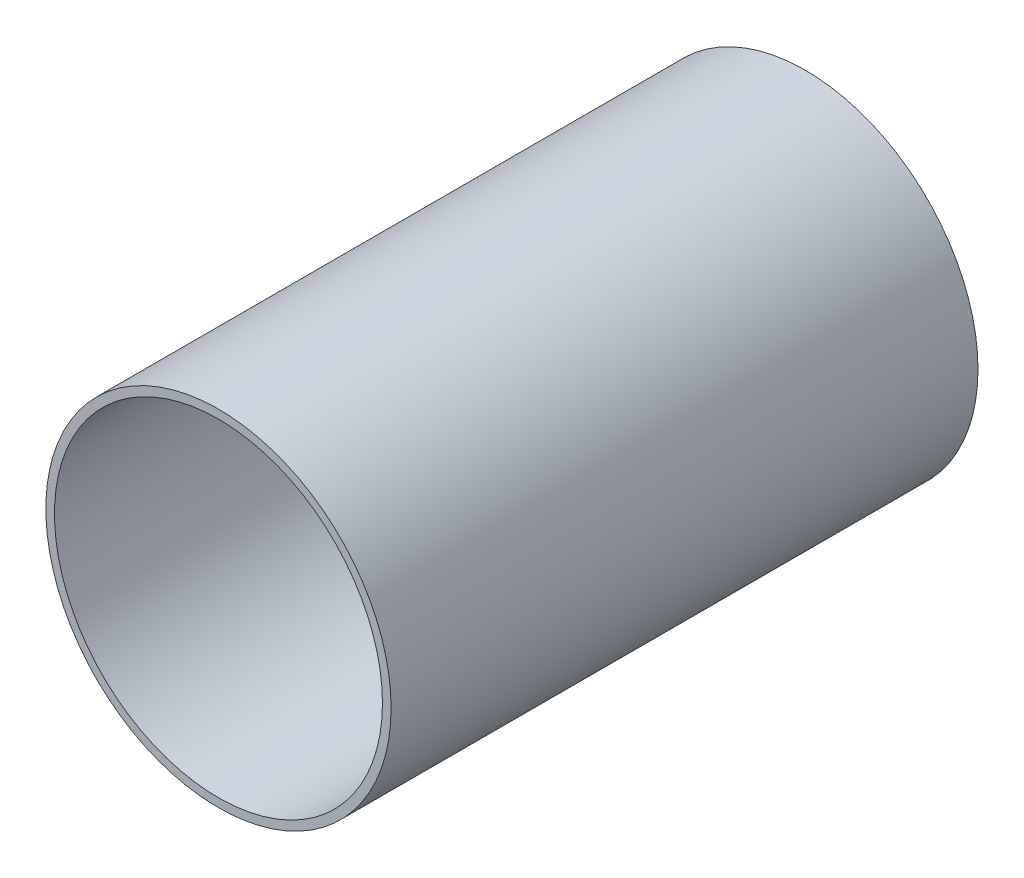
ISO-10303-21;
HEADER;
FILE_DESCRIPTION(('STEP AP214'),'2;1');
FILE_NAME('part.step','',(''),(''),'','','');
FILE_SCHEMA(('AUTOMOTIVE_DESIGN { 1 0 10303 214 1 1 1 1 }'));
ENDSEC;
DATA;
#1=APPLICATION_CONTEXT('core data for automotive mechanical design processes');
#2=APPLICATION_PROTOCOL_DEFINITION('international standard','automotive_design',2000,#1);
#3=PRODUCT_CONTEXT('',#1,'mechanical');
#4=PRODUCT('Part','Part','',(#3));
#5=PRODUCT_RELATED_PRODUCT_CATEGORY('part','',(#4));
#6=PRODUCT_DEFINITION_FORMATION('','',#4);
#7=PRODUCT_DEFINITION_CONTEXT('part definition',#1,'design');
#8=PRODUCT_DEFINITION('design','',#6,#7);
#9=PRODUCT_DEFINITION_SHAPE('','',#8);
#10=(LENGTH_UNIT() NAMED_UNIT(*) SI_UNIT(.MILLI.,.METRE.));
#11=(NAMED_UNIT(*) PLANE_ANGLE_UNIT() SI_UNIT($,.RADIAN.));
#12=(NAMED_UNIT(*) SI_UNIT($,.STERADIAN.) SOLID_ANGLE_UNIT());
#13=UNCERTAINTY_MEASURE_WITH_UNIT(LENGTH_MEASURE(1.E-05),#10,'distance_accuracy_value','');
#14=(GEOMETRIC_REPRESENTATION_CONTEXT(3) GLOBAL_UNCERTAINTY_ASSIGNED_CONTEXT((#13)) GLOBAL_UNIT_ASSIGNED_CONTEXT((#10,
#11,#12)) REPRESENTATION_CONTEXT('',''));
#15=CARTESIAN_POINT('',(0.,0.,0.));
#16=DIRECTION('',(0.,0.,1.));
#17=DIRECTION('',(1.,0.,0.));
#18=AXIS2_PLACEMENT_3D('',#15,#16,#17);
#19=CARTESIAN_POINT('',(0.,0.,1.));
#20=DIRECTION('',(0.,0.,-1.));
#21=DIRECTION('',(-1.,0.,0.));
#22=AXIS2_PLACEMENT_3D('',#19,#20,#21);
#23=CYLINDRICAL_SURFACE('',#22,10.);
#24=CARTESIAN_POINT('',(0.,0.,0.));
#25=DIRECTION('',(0.,0.,1.));
#26=DIRECTION('',(1.,0.,0.));
#27=AXIS2_PLACEMENT_3D('',#24,#25,#26);
#28=CIRCLE('',#27,10.);
#29=CARTESIAN_POINT('',(10.,0.,0.));
#30=VERTEX_POINT('',#29);
#31=EDGE_CURVE('E59',#30,#30,#28,.T.);
#32=ORIENTED_EDGE('',*,*,#31,.T.);
#33=EDGE_LOOP('',(#32));
#34=FACE_BOUND('',#33,.T.);
#35=CARTESIAN_POINT('',(0.,0.,34.));
#36=DIRECTION('',(0.,0.,1.));
#37=DIRECTION('',(1.,0.,0.));
#38=AXIS2_PLACEMENT_3D('',#35,#36,#37);
#39=CIRCLE('',#38,10.);
#40=CARTESIAN_POINT('',(10.,0.,34.));
#41=VERTEX_POINT('',#40);
#42=EDGE_CURVE('E64',#41,#41,#39,.T.);
#43=ORIENTED_EDGE('',*,*,#42,.F.);
#44=EDGE_LOOP('',(#43));
#45=FACE_BOUND('',#44,.T.);
#46=ADVANCED_FACE('F45',(#34,#45),#23,.T.);
#47=CARTESIAN_POINT('',(0.,0.,0.));
#48=DIRECTION('',(0.,0.,1.));
#49=DIRECTION('',(1.,0.,0.));
#50=AXIS2_PLACEMENT_3D('',#47,#48,#49);
#51=PLANE('',#50);
#52=ORIENTED_EDGE('',*,*,#31,.F.);
#53=EDGE_LOOP('',(#52));
#54=FACE_BOUND('',#53,.T.);
#55=ADVANCED_FACE('F79',(#54),#51,.F.);
#56=CARTESIAN_POINT('',(0.,0.,34.));
#57=DIRECTION('',(0.,0.,1.));
#58=DIRECTION('',(1.,0.,0.));
#59=AXIS2_PLACEMENT_3D('',#56,#57,#58);
#60=PLANE('',#59);
#61=ORIENTED_EDGE('',*,*,#42,.T.);
#62=EDGE_LOOP('',(#61));
#63=FACE_BOUND('',#62,.T.);
#64=CARTESIAN_POINT('',(0.,0.,34.));
#65=DIRECTION('',(0.,0.,1.));
#66=DIRECTION('',(1.,0.,0.));
#67=AXIS2_PLACEMENT_3D('',#64,#65,#66);
#68=CIRCLE('',#67,9.5);
#69=CARTESIAN_POINT('',(9.5,0.,34.));
#70=VERTEX_POINT('',#69);
#71=EDGE_CURVE('E70',#70,#70,#68,.T.);
#72=ORIENTED_EDGE('',*,*,#71,.F.);
#73=EDGE_LOOP('',(#72));
#74=FACE_BOUND('',#73,.T.);
#75=ADVANCED_FACE('F77',(#63,#74),#60,.T.);
#76=CARTESIAN_POINT('',(0.,0.,34.));
#77=DIRECTION('',(0.,0.,-1.));
#78=DIRECTION('',(-1.,0.,0.));
#79=AXIS2_PLACEMENT_3D('',#76,#77,#78);
#80=CYLINDRICAL_SURFACE('',#79,9.5);
#81=CARTESIAN_POINT('',(0.,0.,2.));
#82=DIRECTION('',(0.,0.,1.));
#83=DIRECTION('',(1.,0.,0.));
#84=AXIS2_PLACEMENT_3D('',#81,#82,#83);
#85=CIRCLE('',#84,9.5);
#86=CARTESIAN_POINT('',(9.5,0.,2.));
#87=VERTEX_POINT('',#86);
#88=EDGE_CURVE('E54',#87,#87,#85,.F.);
#89=ORIENTED_EDGE('',*,*,#88,.T.);
#90=EDGE_LOOP('',(#89));
#91=FACE_BOUND('',#90,.T.);
#92=ORIENTED_EDGE('',*,*,#71,.T.);
#93=EDGE_LOOP('',(#92));
#94=FACE_BOUND('',#93,.T.);
#95=ADVANCED_FACE('F75',(#91,#94),#80,.F.);
#96=CARTESIAN_POINT('',(0.,0.,1.));
#97=DIRECTION('',(0.,0.,1.));
#98=DIRECTION('',(1.,0.,0.));
#99=AXIS2_PLACEMENT_3D('',#96,#97,#98);
#100=PLANE('',#99);
#101=CARTESIAN_POINT('',(0.,0.,1.));
#102=DIRECTION('',(0.,0.,1.));
#103=DIRECTION('',(1.,0.,0.));
#104=AXIS2_PLACEMENT_3D('',#101,#102,#103);
#105=CIRCLE('',#104,8.5);
#106=CARTESIAN_POINT('',(8.5,0.,1.));
#107=VERTEX_POINT('',#106);
#108=EDGE_CURVE('E10',#107,#107,#105,.T.);
#109=ORIENTED_EDGE('',*,*,#108,.T.);
#110=EDGE_LOOP('',(#109));
#111=FACE_BOUND('',#110,.T.);
#112=ADVANCED_FACE('F86',(#111),#100,.T.);
#113=CARTESIAN_POINT('',(0.,0.,2.));
#114=DIRECTION('',(0.,0.,1.));
#115=DIRECTION('',(1.,0.,0.));
#116=AXIS2_PLACEMENT_3D('',#113,#114,#115);
#117=CONICAL_SURFACE('',#116,9.5,0.785398163397446);
#118=ORIENTED_EDGE('',*,*,#108,.F.);
#119=EDGE_LOOP('',(#118));
#120=FACE_BOUND('',#119,.T.);
#121=ORIENTED_EDGE('',*,*,#88,.F.);
#122=EDGE_LOOP('',(#121));
#123=FACE_BOUND('',#122,.T.);
#124=ADVANCED_FACE('F48',(#120,#123),#117,.F.);
#125=CLOSED_SHELL('',(#46,#55,#75,#95,#112,#124));
#126=MANIFOLD_SOLID_BREP('B2',#125);
#127=ADVANCED_BREP_SHAPE_REPRESENTATION('',(#18,#126),#14);
#128=SHAPE_DEFINITION_REPRESENTATION(#9,#127);
ENDSEC;
END-ISO-10303-21;
